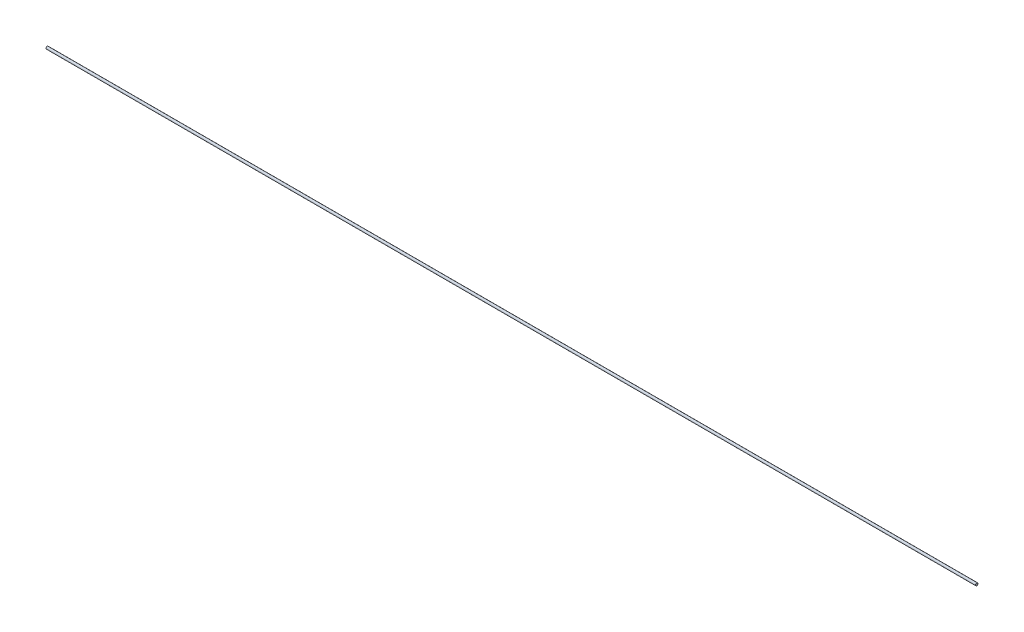
ISO-10303-21;
HEADER;
FILE_DESCRIPTION(('STEP AP214'),'2;1');
FILE_NAME('part.step','',(''),(''),'','','');
FILE_SCHEMA(('AUTOMOTIVE_DESIGN { 1 0 10303 214 1 1 1 1 }'));
ENDSEC;
DATA;
#1=APPLICATION_CONTEXT('core data for automotive mechanical design processes');
#2=APPLICATION_PROTOCOL_DEFINITION('international standard','automotive_design',2000,#1);
#3=PRODUCT_CONTEXT('',#1,'mechanical');
#4=PRODUCT('Part','Part','',(#3));
#5=PRODUCT_RELATED_PRODUCT_CATEGORY('part','',(#4));
#6=PRODUCT_DEFINITION_FORMATION('','',#4);
#7=PRODUCT_DEFINITION_CONTEXT('part definition',#1,'design');
#8=PRODUCT_DEFINITION('design','',#6,#7);
#9=PRODUCT_DEFINITION_SHAPE('','',#8);
#10=(LENGTH_UNIT() NAMED_UNIT(*) SI_UNIT(.MILLI.,.METRE.));
#11=(NAMED_UNIT(*) PLANE_ANGLE_UNIT() SI_UNIT($,.RADIAN.));
#12=(NAMED_UNIT(*) SI_UNIT($,.STERADIAN.) SOLID_ANGLE_UNIT());
#13=UNCERTAINTY_MEASURE_WITH_UNIT(LENGTH_MEASURE(1.E-05),#10,'distance_accuracy_value','');
#14=(GEOMETRIC_REPRESENTATION_CONTEXT(3) GLOBAL_UNCERTAINTY_ASSIGNED_CONTEXT((#13)) GLOBAL_UNIT_ASSIGNED_CONTEXT((#10,
#11,#12)) REPRESENTATION_CONTEXT('',''));
#15=CARTESIAN_POINT('',(0.,0.,0.));
#16=DIRECTION('',(0.,0.,1.));
#17=DIRECTION('',(1.,0.,0.));
#18=AXIS2_PLACEMENT_3D('',#15,#16,#17);
#19=CARTESIAN_POINT('',(1900.,0.,0.));
#20=DIRECTION('',(-1.,0.,0.));
#21=DIRECTION('',(0.,0.,1.));
#22=AXIS2_PLACEMENT_3D('',#19,#20,#21);
#23=CYLINDRICAL_SURFACE('',#22,2.5);
#24=CARTESIAN_POINT('',(1900.,0.,0.));
#25=DIRECTION('',(1.,0.,0.));
#26=DIRECTION('',(0.,0.,-1.));
#27=AXIS2_PLACEMENT_3D('',#24,#25,#26);
#28=CIRCLE('',#27,2.5);
#29=CARTESIAN_POINT('',(1900.,0.,2.5));
#30=VERTEX_POINT('',#29);
#31=EDGE_CURVE('E10',#30,#30,#28,.T.);
#32=CARTESIAN_POINT('',(0.,0.,0.));
#33=DIRECTION('',(1.,0.,0.));
#34=DIRECTION('',(0.,0.,-1.));
#35=AXIS2_PLACEMENT_3D('',#32,#33,#34);
#36=CIRCLE('',#35,2.5);
#37=CARTESIAN_POINT('',(-2.22044604925031E-13,0.,2.5));
#38=VERTEX_POINT('',#37);
#39=EDGE_CURVE('E35',#38,#38,#36,.T.);
#40=CARTESIAN_POINT('',(1900.,0.,2.5));
#41=CARTESIAN_POINT('',(1880.20833333333,0.,2.5));
#42=CARTESIAN_POINT('',(1860.41666666667,0.,2.5));
#43=CARTESIAN_POINT('',(1820.83333333333,0.,2.5));
#44=CARTESIAN_POINT('',(1801.04166666667,0.,2.5));
#45=CARTESIAN_POINT('',(1761.45833333333,0.,2.5));
#46=CARTESIAN_POINT('',(1741.66666666667,0.,2.5));
#47=CARTESIAN_POINT('',(1702.08333333333,0.,2.5));
#48=CARTESIAN_POINT('',(1682.29166666667,0.,2.5));
#49=CARTESIAN_POINT('',(1642.70833333333,0.,2.5));
#50=CARTESIAN_POINT('',(1622.91666666667,0.,2.5));
#51=CARTESIAN_POINT('',(1583.33333333333,0.,2.5));
#52=CARTESIAN_POINT('',(1563.54166666667,0.,2.5));
#53=CARTESIAN_POINT('',(1523.95833333333,0.,2.5));
#54=CARTESIAN_POINT('',(1504.16666666667,0.,2.5));
#55=CARTESIAN_POINT('',(1464.58333333333,0.,2.5));
#56=CARTESIAN_POINT('',(1444.79166666667,0.,2.5));
#57=CARTESIAN_POINT('',(1405.20833333333,0.,2.5));
#58=CARTESIAN_POINT('',(1385.41666666667,0.,2.5));
#59=CARTESIAN_POINT('',(1345.83333333333,0.,2.5));
#60=CARTESIAN_POINT('',(1326.04166666667,0.,2.5));
#61=CARTESIAN_POINT('',(1286.45833333333,0.,2.5));
#62=CARTESIAN_POINT('',(1266.66666666667,0.,2.5));
#63=CARTESIAN_POINT('',(1227.08333333333,0.,2.5));
#64=CARTESIAN_POINT('',(1207.29166666667,0.,2.5));
#65=CARTESIAN_POINT('',(1167.70833333333,0.,2.5));
#66=CARTESIAN_POINT('',(1147.91666666667,0.,2.5));
#67=CARTESIAN_POINT('',(1108.33333333333,0.,2.5));
#68=CARTESIAN_POINT('',(1088.54166666667,0.,2.5));
#69=CARTESIAN_POINT('',(1048.95833333333,0.,2.5));
#70=CARTESIAN_POINT('',(1029.16666666667,0.,2.5));
#71=CARTESIAN_POINT('',(989.583333333333,0.,2.5));
#72=CARTESIAN_POINT('',(969.791666666667,0.,2.5));
#73=CARTESIAN_POINT('',(930.208333333333,0.,2.5));
#74=CARTESIAN_POINT('',(910.416666666666,0.,2.5));
#75=CARTESIAN_POINT('',(870.833333333333,0.,2.5));
#76=CARTESIAN_POINT('',(851.041666666667,0.,2.5));
#77=CARTESIAN_POINT('',(811.458333333333,0.,2.5));
#78=CARTESIAN_POINT('',(791.666666666667,0.,2.5));
#79=CARTESIAN_POINT('',(752.083333333333,0.,2.5));
#80=CARTESIAN_POINT('',(732.291666666667,0.,2.5));
#81=CARTESIAN_POINT('',(692.708333333333,0.,2.5));
#82=CARTESIAN_POINT('',(672.916666666667,0.,2.5));
#83=CARTESIAN_POINT('',(633.333333333333,0.,2.5));
#84=CARTESIAN_POINT('',(613.541666666666,0.,2.5));
#85=CARTESIAN_POINT('',(573.958333333333,0.,2.5));
#86=CARTESIAN_POINT('',(554.166666666667,0.,2.5));
#87=CARTESIAN_POINT('',(514.583333333333,0.,2.5));
#88=CARTESIAN_POINT('',(494.791666666667,0.,2.5));
#89=CARTESIAN_POINT('',(455.208333333333,0.,2.5));
#90=CARTESIAN_POINT('',(435.416666666667,0.,2.5));
#91=CARTESIAN_POINT('',(395.833333333333,0.,2.5));
#92=CARTESIAN_POINT('',(376.041666666666,0.,2.5));
#93=CARTESIAN_POINT('',(336.458333333333,0.,2.5));
#94=CARTESIAN_POINT('',(316.666666666666,0.,2.5));
#95=CARTESIAN_POINT('',(277.083333333333,0.,2.5));
#96=CARTESIAN_POINT('',(257.291666666666,0.,2.5));
#97=CARTESIAN_POINT('',(217.708333333333,0.,2.5));
#98=CARTESIAN_POINT('',(197.916666666667,0.,2.5));
#99=CARTESIAN_POINT('',(158.333333333333,0.,2.5));
#100=CARTESIAN_POINT('',(138.541666666666,0.,2.5));
#101=CARTESIAN_POINT('',(98.958333333333,0.,2.5));
#102=CARTESIAN_POINT('',(79.1666666666664,0.,2.5));
#103=CARTESIAN_POINT('',(39.5833333333331,0.,2.5));
#104=CARTESIAN_POINT('',(19.7916666666664,0.,2.5));
#105=CARTESIAN_POINT('',(-2.22044604925031E-13,0.,2.5));
#106=B_SPLINE_CURVE_WITH_KNOTS('',3,(#40,#41,#42,#43,#44,#45,#46,#47,#48,#49,#50,#51,#52,#53,
#54,#55,#56,#57,#58,#59,#60,#61,#62,#63,#64,#65,#66,#67,#68,#69,#70,#71,#72,#73,#74,#75,#76,#77,
#78,#79,#80,#81,#82,#83,#84,#85,#86,#87,#88,#89,#90,#91,#92,#93,#94,#95,#96,#97,#98,#99,#100,
#101,#102,#103,#104,#105),.UNSPECIFIED.,.F.,.F.,(4,2,2,2,2,2,2,2,2,2,2,2,2,2,2,2,2,2,2,2,2,2,2,
2,2,2,2,2,2,2,2,2,4),(0.,59.375,118.75,178.125,237.5,296.875,356.25,415.625,475.,534.375,593.75,
653.125,712.5,771.875,831.25,890.625,950.,1009.375,1068.75,1128.125,1187.5,1246.875,1306.25,
1365.625,1425.,1484.375,1543.75,1603.125,1662.5,1721.875,1781.25,1840.625,1900.),.UNSPECIFIED.);
#107=EDGE_CURVE('BSEAM32',#30,#38,#106,.T.);
#108=ORIENTED_EDGE('',*,*,#31,.F.);
#109=ORIENTED_EDGE('',*,*,#39,.T.);
#110=ORIENTED_EDGE('',*,*,#107,.T.);
#111=ORIENTED_EDGE('',*,*,#107,.F.);
#112=EDGE_LOOP('',(#108,#110,#109,#111));
#113=FACE_BOUND('',#112,.T.);
#114=ADVANCED_FACE('F32',(#113),#23,.T.);
#115=CARTESIAN_POINT('',(1900.,0.,0.));
#116=DIRECTION('',(1.,0.,0.));
#117=DIRECTION('',(0.,0.,-1.));
#118=AXIS2_PLACEMENT_3D('',#115,#116,#117);
#119=PLANE('',#118);
#120=ORIENTED_EDGE('',*,*,#31,.T.);
#121=EDGE_LOOP('',(#120));
#122=FACE_BOUND('',#121,.T.);
#123=ADVANCED_FACE('F47',(#122),#119,.T.);
#124=CARTESIAN_POINT('',(0.,0.,0.));
#125=DIRECTION('',(1.,0.,0.));
#126=DIRECTION('',(0.,0.,-1.));
#127=AXIS2_PLACEMENT_3D('',#124,#125,#126);
#128=PLANE('',#127);
#129=ORIENTED_EDGE('',*,*,#39,.F.);
#130=EDGE_LOOP('',(#129));
#131=FACE_BOUND('',#130,.T.);
#132=ADVANCED_FACE('F45',(#131),#128,.F.);
#133=CLOSED_SHELL('',(#114,#123,#132));
#134=MANIFOLD_SOLID_BREP('B2',#133);
#135=ADVANCED_BREP_SHAPE_REPRESENTATION('',(#18,#134),#14);
#136=SHAPE_DEFINITION_REPRESENTATION(#9,#135);
ENDSEC;
END-ISO-10303-21;
